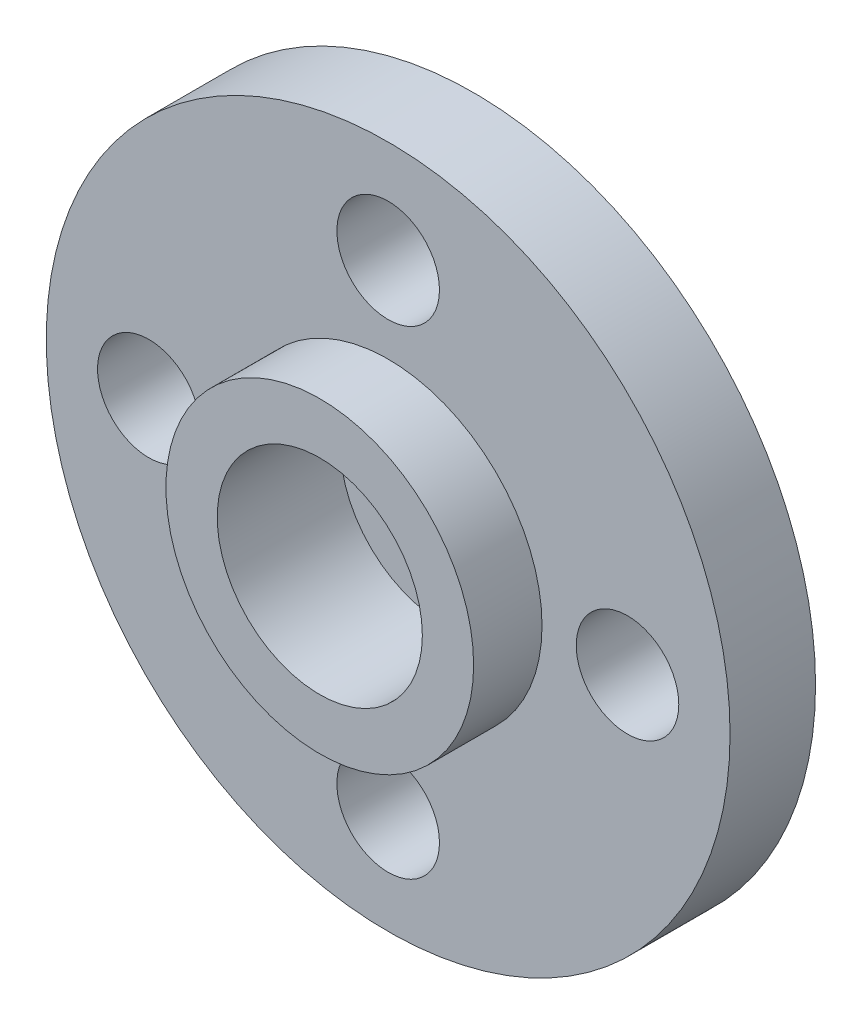
ISO-10303-21;
HEADER;
FILE_DESCRIPTION(('STEP AP214'),'2;1');
FILE_NAME('part.step','',(''),(''),'','','');
FILE_SCHEMA(('AUTOMOTIVE_DESIGN { 1 0 10303 214 1 1 1 1 }'));
ENDSEC;
DATA;
#1=APPLICATION_CONTEXT('core data for automotive mechanical design processes');
#2=APPLICATION_PROTOCOL_DEFINITION('international standard','automotive_design',2000,#1);
#3=PRODUCT_CONTEXT('',#1,'mechanical');
#4=PRODUCT('Part','Part','',(#3));
#5=PRODUCT_RELATED_PRODUCT_CATEGORY('part','',(#4));
#6=PRODUCT_DEFINITION_FORMATION('','',#4);
#7=PRODUCT_DEFINITION_CONTEXT('part definition',#1,'design');
#8=PRODUCT_DEFINITION('design','',#6,#7);
#9=PRODUCT_DEFINITION_SHAPE('','',#8);
#10=(LENGTH_UNIT() NAMED_UNIT(*) SI_UNIT(.MILLI.,.METRE.));
#11=(NAMED_UNIT(*) PLANE_ANGLE_UNIT() SI_UNIT($,.RADIAN.));
#12=(NAMED_UNIT(*) SI_UNIT($,.STERADIAN.) SOLID_ANGLE_UNIT());
#13=UNCERTAINTY_MEASURE_WITH_UNIT(LENGTH_MEASURE(1.E-05),#10,'distance_accuracy_value','');
#14=(GEOMETRIC_REPRESENTATION_CONTEXT(3) GLOBAL_UNCERTAINTY_ASSIGNED_CONTEXT((#13)) GLOBAL_UNIT_ASSIGNED_CONTEXT((#10,
#11,#12)) REPRESENTATION_CONTEXT('',''));
#15=CARTESIAN_POINT('',(0.,0.,0.));
#16=DIRECTION('',(0.,0.,1.));
#17=DIRECTION('',(1.,0.,0.));
#18=AXIS2_PLACEMENT_3D('',#15,#16,#17);
#19=CARTESIAN_POINT('',(0.,0.,2.5));
#20=DIRECTION('',(0.,0.,-1.));
#21=DIRECTION('',(-1.,0.,0.));
#22=AXIS2_PLACEMENT_3D('',#19,#20,#21);
#23=CYLINDRICAL_SURFACE('',#22,10.);
#24=CARTESIAN_POINT('',(0.,0.,2.5));
#25=DIRECTION('',(0.,0.,1.));
#26=DIRECTION('',(1.,0.,0.));
#27=AXIS2_PLACEMENT_3D('',#24,#25,#26);
#28=CIRCLE('',#27,10.);
#29=CARTESIAN_POINT('',(10.,0.,2.5));
#30=VERTEX_POINT('',#29);
#31=EDGE_CURVE('E47',#30,#30,#28,.T.);
#32=ORIENTED_EDGE('',*,*,#31,.F.);
#33=EDGE_LOOP('',(#32));
#34=FACE_BOUND('',#33,.T.);
#35=CARTESIAN_POINT('',(0.,0.,0.));
#36=DIRECTION('',(0.,0.,1.));
#37=DIRECTION('',(1.,0.,0.));
#38=AXIS2_PLACEMENT_3D('',#35,#36,#37);
#39=CIRCLE('',#38,10.);
#40=CARTESIAN_POINT('',(10.,0.,0.));
#41=VERTEX_POINT('',#40);
#42=EDGE_CURVE('E44',#41,#41,#39,.T.);
#43=ORIENTED_EDGE('',*,*,#42,.T.);
#44=EDGE_LOOP('',(#43));
#45=FACE_BOUND('',#44,.T.);
#46=ADVANCED_FACE('F45',(#34,#45),#23,.T.);
#47=CARTESIAN_POINT('',(0.,0.,2.5));
#48=DIRECTION('',(0.,0.,1.));
#49=DIRECTION('',(1.,0.,0.));
#50=AXIS2_PLACEMENT_3D('',#47,#48,#49);
#51=PLANE('',#50);
#52=CARTESIAN_POINT('',(0.,7.,2.5));
#53=DIRECTION('',(0.,0.,1.));
#54=DIRECTION('',(1.,0.,0.));
#55=AXIS2_PLACEMENT_3D('',#52,#53,#54);
#56=CIRCLE('',#55,1.5);
#57=CARTESIAN_POINT('',(1.5,7.,2.5));
#58=VERTEX_POINT('',#57);
#59=EDGE_CURVE('E87',#58,#58,#56,.T.);
#60=ORIENTED_EDGE('',*,*,#59,.F.);
#61=EDGE_LOOP('',(#60));
#62=FACE_BOUND('',#61,.T.);
#63=CARTESIAN_POINT('',(7.0000000000002,1.97666086873723E-13,2.5));
#64=DIRECTION('',(0.,0.,1.));
#65=DIRECTION('',(1.,0.,0.));
#66=AXIS2_PLACEMENT_3D('',#63,#64,#65);
#67=CIRCLE('',#66,1.50000000000015);
#68=CARTESIAN_POINT('',(8.50000000000035,1.97666086873723E-13,2.5));
#69=VERTEX_POINT('',#68);
#70=EDGE_CURVE('E82',#69,#69,#67,.T.);
#71=ORIENTED_EDGE('',*,*,#70,.F.);
#72=EDGE_LOOP('',(#71));
#73=FACE_BOUND('',#72,.T.);
#74=CARTESIAN_POINT('',(3.95332173747447E-13,-7.,2.5));
#75=DIRECTION('',(0.,0.,1.));
#76=DIRECTION('',(1.,0.,0.));
#77=AXIS2_PLACEMENT_3D('',#74,#75,#76);
#78=CIRCLE('',#77,1.50000000000042);
#79=CARTESIAN_POINT('',(1.50000000000082,-7.,2.5));
#80=VERTEX_POINT('',#79);
#81=EDGE_CURVE('E79',#80,#80,#78,.T.);
#82=ORIENTED_EDGE('',*,*,#81,.F.);
#83=EDGE_LOOP('',(#82));
#84=FACE_BOUND('',#83,.T.);
#85=CARTESIAN_POINT('',(-6.9999999999998,-1.98523339633126E-13,2.5));
#86=DIRECTION('',(0.,0.,1.));
#87=DIRECTION('',(1.,0.,0.));
#88=AXIS2_PLACEMENT_3D('',#85,#86,#87);
#89=CIRCLE('',#88,1.50000000000032);
#90=CARTESIAN_POINT('',(-5.49999999999949,-1.98523339633126E-13,2.5));
#91=VERTEX_POINT('',#90);
#92=EDGE_CURVE('E72',#91,#91,#89,.T.);
#93=ORIENTED_EDGE('',*,*,#92,.F.);
#94=EDGE_LOOP('',(#93));
#95=FACE_BOUND('',#94,.T.);
#96=CARTESIAN_POINT('',(0.,0.,2.5));
#97=DIRECTION('',(0.,0.,1.));
#98=DIRECTION('',(1.,0.,0.));
#99=AXIS2_PLACEMENT_3D('',#96,#97,#98);
#100=CIRCLE('',#99,4.5);
#101=CARTESIAN_POINT('',(4.5,0.,2.5));
#102=VERTEX_POINT('',#101);
#103=EDGE_CURVE('E10',#102,#102,#100,.T.);
#104=ORIENTED_EDGE('',*,*,#103,.F.);
#105=EDGE_LOOP('',(#104));
#106=FACE_BOUND('',#105,.T.);
#107=ORIENTED_EDGE('',*,*,#31,.T.);
#108=EDGE_LOOP('',(#107));
#109=FACE_BOUND('',#108,.T.);
#110=ADVANCED_FACE('F98',(#62,#73,#84,#95,#106,#109),#51,.T.);
#111=CARTESIAN_POINT('',(0.,0.,0.));
#112=DIRECTION('',(0.,0.,1.));
#113=DIRECTION('',(1.,0.,0.));
#114=AXIS2_PLACEMENT_3D('',#111,#112,#113);
#115=PLANE('',#114);
#116=CARTESIAN_POINT('',(0.,7.,0.));
#117=DIRECTION('',(0.,0.,1.));
#118=DIRECTION('',(1.,0.,0.));
#119=AXIS2_PLACEMENT_3D('',#116,#117,#118);
#120=CIRCLE('',#119,1.5);
#121=CARTESIAN_POINT('',(1.5,7.,0.));
#122=VERTEX_POINT('',#121);
#123=EDGE_CURVE('E68',#122,#122,#120,.F.);
#124=ORIENTED_EDGE('',*,*,#123,.F.);
#125=EDGE_LOOP('',(#124));
#126=FACE_BOUND('',#125,.T.);
#127=CARTESIAN_POINT('',(7.0000000000002,1.97666086873723E-13,0.));
#128=DIRECTION('',(0.,0.,1.));
#129=DIRECTION('',(1.,0.,0.));
#130=AXIS2_PLACEMENT_3D('',#127,#128,#129);
#131=CIRCLE('',#130,1.50000000000015);
#132=CARTESIAN_POINT('',(8.50000000000035,1.97666086873723E-13,0.));
#133=VERTEX_POINT('',#132);
#134=EDGE_CURVE('E81',#133,#133,#131,.F.);
#135=ORIENTED_EDGE('',*,*,#134,.F.);
#136=EDGE_LOOP('',(#135));
#137=FACE_BOUND('',#136,.T.);
#138=CARTESIAN_POINT('',(3.95332173747447E-13,-7.,0.));
#139=DIRECTION('',(0.,0.,1.));
#140=DIRECTION('',(1.,0.,0.));
#141=AXIS2_PLACEMENT_3D('',#138,#139,#140);
#142=CIRCLE('',#141,1.50000000000042);
#143=CARTESIAN_POINT('',(1.50000000000082,-7.,0.));
#144=VERTEX_POINT('',#143);
#145=EDGE_CURVE('E74',#144,#144,#142,.F.);
#146=ORIENTED_EDGE('',*,*,#145,.F.);
#147=EDGE_LOOP('',(#146));
#148=FACE_BOUND('',#147,.T.);
#149=CARTESIAN_POINT('',(-6.9999999999998,-1.98523339633126E-13,0.));
#150=DIRECTION('',(0.,0.,1.));
#151=DIRECTION('',(1.,0.,0.));
#152=AXIS2_PLACEMENT_3D('',#149,#150,#151);
#153=CIRCLE('',#152,1.50000000000032);
#154=CARTESIAN_POINT('',(-5.49999999999949,-1.98523339633126E-13,0.));
#155=VERTEX_POINT('',#154);
#156=EDGE_CURVE('E73',#155,#155,#153,.F.);
#157=ORIENTED_EDGE('',*,*,#156,.F.);
#158=EDGE_LOOP('',(#157));
#159=FACE_BOUND('',#158,.T.);
#160=CARTESIAN_POINT('',(0.,0.,0.));
#161=DIRECTION('',(0.,0.,1.));
#162=DIRECTION('',(1.,0.,0.));
#163=AXIS2_PLACEMENT_3D('',#160,#161,#162);
#164=CIRCLE('',#163,1.6);
#165=CARTESIAN_POINT('',(1.6,0.,0.));
#166=VERTEX_POINT('',#165);
#167=EDGE_CURVE('E62',#166,#166,#164,.F.);
#168=ORIENTED_EDGE('',*,*,#167,.F.);
#169=EDGE_LOOP('',(#168));
#170=FACE_BOUND('',#169,.T.);
#171=ORIENTED_EDGE('',*,*,#42,.F.);
#172=EDGE_LOOP('',(#171));
#173=FACE_BOUND('',#172,.T.);
#174=ADVANCED_FACE('F101',(#126,#137,#148,#159,#170,#173),#115,.F.);
#175=CARTESIAN_POINT('',(0.,0.,4.5));
#176=DIRECTION('',(0.,0.,-1.));
#177=DIRECTION('',(-1.,0.,0.));
#178=AXIS2_PLACEMENT_3D('',#175,#176,#177);
#179=CYLINDRICAL_SURFACE('',#178,4.5);
#180=CARTESIAN_POINT('',(0.,0.,4.5));
#181=DIRECTION('',(0.,0.,1.));
#182=DIRECTION('',(1.,0.,0.));
#183=AXIS2_PLACEMENT_3D('',#180,#181,#182);
#184=CIRCLE('',#183,4.5);
#185=CARTESIAN_POINT('',(4.5,0.,4.5));
#186=VERTEX_POINT('',#185);
#187=EDGE_CURVE('E54',#186,#186,#184,.T.);
#188=ORIENTED_EDGE('',*,*,#187,.F.);
#189=EDGE_LOOP('',(#188));
#190=FACE_BOUND('',#189,.T.);
#191=ORIENTED_EDGE('',*,*,#103,.T.);
#192=EDGE_LOOP('',(#191));
#193=FACE_BOUND('',#192,.T.);
#194=ADVANCED_FACE('F119',(#190,#193),#179,.T.);
#195=CARTESIAN_POINT('',(0.,0.,4.5));
#196=DIRECTION('',(0.,0.,1.));
#197=DIRECTION('',(1.,0.,0.));
#198=AXIS2_PLACEMENT_3D('',#195,#196,#197);
#199=PLANE('',#198);
#200=CARTESIAN_POINT('',(0.,0.,4.5));
#201=DIRECTION('',(0.,0.,1.));
#202=DIRECTION('',(1.,0.,0.));
#203=AXIS2_PLACEMENT_3D('',#200,#201,#202);
#204=CIRCLE('',#203,3.);
#205=CARTESIAN_POINT('',(3.,0.,4.5));
#206=VERTEX_POINT('',#205);
#207=EDGE_CURVE('E56',#206,#206,#204,.T.);
#208=ORIENTED_EDGE('',*,*,#207,.F.);
#209=EDGE_LOOP('',(#208));
#210=FACE_BOUND('',#209,.T.);
#211=ORIENTED_EDGE('',*,*,#187,.T.);
#212=EDGE_LOOP('',(#211));
#213=FACE_BOUND('',#212,.T.);
#214=ADVANCED_FACE('F121',(#210,#213),#199,.T.);
#215=CARTESIAN_POINT('',(0.,0.,0.900000000000001));
#216=DIRECTION('',(0.,0.,1.));
#217=DIRECTION('',(1.,0.,0.));
#218=AXIS2_PLACEMENT_3D('',#215,#216,#217);
#219=CYLINDRICAL_SURFACE('',#218,3.);
#220=CARTESIAN_POINT('',(0.,0.,0.900000000000001));
#221=DIRECTION('',(0.,0.,1.));
#222=DIRECTION('',(1.,0.,0.));
#223=AXIS2_PLACEMENT_3D('',#220,#221,#222);
#224=CIRCLE('',#223,3.);
#225=CARTESIAN_POINT('',(3.,0.,0.900000000000001));
#226=VERTEX_POINT('',#225);
#227=EDGE_CURVE('E59',#226,#226,#224,.T.);
#228=ORIENTED_EDGE('',*,*,#227,.F.);
#229=EDGE_LOOP('',(#228));
#230=FACE_BOUND('',#229,.T.);
#231=ORIENTED_EDGE('',*,*,#207,.T.);
#232=EDGE_LOOP('',(#231));
#233=FACE_BOUND('',#232,.T.);
#234=ADVANCED_FACE('F132',(#230,#233),#219,.F.);
#235=CARTESIAN_POINT('',(0.,0.,0.900000000000001));
#236=DIRECTION('',(0.,0.,1.));
#237=DIRECTION('',(1.,0.,0.));
#238=AXIS2_PLACEMENT_3D('',#235,#236,#237);
#239=PLANE('',#238);
#240=CARTESIAN_POINT('',(0.,0.,0.900000000000001));
#241=DIRECTION('',(0.,0.,1.));
#242=DIRECTION('',(1.,0.,0.));
#243=AXIS2_PLACEMENT_3D('',#240,#241,#242);
#244=CIRCLE('',#243,1.6);
#245=CARTESIAN_POINT('',(1.6,0.,0.900000000000001));
#246=VERTEX_POINT('',#245);
#247=EDGE_CURVE('E70',#246,#246,#244,.T.);
#248=ORIENTED_EDGE('',*,*,#247,.F.);
#249=EDGE_LOOP('',(#248));
#250=FACE_BOUND('',#249,.T.);
#251=ORIENTED_EDGE('',*,*,#227,.T.);
#252=EDGE_LOOP('',(#251));
#253=FACE_BOUND('',#252,.T.);
#254=ADVANCED_FACE('F136',(#250,#253),#239,.T.);
#255=CARTESIAN_POINT('',(0.,0.,-0.00100000000000002));
#256=DIRECTION('',(0.,0.,1.));
#257=DIRECTION('',(1.,0.,0.));
#258=AXIS2_PLACEMENT_3D('',#255,#256,#257);
#259=CYLINDRICAL_SURFACE('',#258,1.6);
#260=CARTESIAN_POINT('',(1.6,0.,0.900000000000001));
#261=CARTESIAN_POINT('',(1.6,0.,0.890625000000001));
#262=CARTESIAN_POINT('',(1.6,0.,0.881250000000001));
#263=CARTESIAN_POINT('',(1.6,0.,0.8625));
#264=CARTESIAN_POINT('',(1.6,0.,0.853125000000001));
#265=CARTESIAN_POINT('',(1.6,0.,0.834375000000001));
#266=CARTESIAN_POINT('',(1.6,0.,0.825000000000001));
#267=CARTESIAN_POINT('',(1.6,0.,0.806250000000001));
#268=CARTESIAN_POINT('',(1.6,0.,0.796875000000001));
#269=CARTESIAN_POINT('',(1.6,0.,0.778125000000001));
#270=CARTESIAN_POINT('',(1.6,0.,0.768750000000001));
#271=CARTESIAN_POINT('',(1.6,0.,0.75));
#272=CARTESIAN_POINT('',(1.6,0.,0.740625000000001));
#273=CARTESIAN_POINT('',(1.6,0.,0.721875));
#274=CARTESIAN_POINT('',(1.6,0.,0.7125));
#275=CARTESIAN_POINT('',(1.6,0.,0.69375));
#276=CARTESIAN_POINT('',(1.6,0.,0.684375));
#277=CARTESIAN_POINT('',(1.6,0.,0.665625));
#278=CARTESIAN_POINT('',(1.6,0.,0.65625));
#279=CARTESIAN_POINT('',(1.6,0.,0.6375));
#280=CARTESIAN_POINT('',(1.6,0.,0.628125));
#281=CARTESIAN_POINT('',(1.6,0.,0.609375));
#282=CARTESIAN_POINT('',(1.6,0.,0.6));
#283=CARTESIAN_POINT('',(1.6,0.,0.58125));
#284=CARTESIAN_POINT('',(1.6,0.,0.571875));
#285=CARTESIAN_POINT('',(1.6,0.,0.553125));
#286=CARTESIAN_POINT('',(1.6,0.,0.54375));
#287=CARTESIAN_POINT('',(1.6,0.,0.525));
#288=CARTESIAN_POINT('',(1.6,0.,0.515625));
#289=CARTESIAN_POINT('',(1.6,0.,0.496875));
#290=CARTESIAN_POINT('',(1.6,0.,0.4875));
#291=CARTESIAN_POINT('',(1.6,0.,0.46875));
#292=CARTESIAN_POINT('',(1.6,0.,0.459375));
#293=CARTESIAN_POINT('',(1.6,0.,0.440625));
#294=CARTESIAN_POINT('',(1.6,0.,0.43125));
#295=CARTESIAN_POINT('',(1.6,0.,0.4125));
#296=CARTESIAN_POINT('',(1.6,0.,0.403125));
#297=CARTESIAN_POINT('',(1.6,0.,0.384375));
#298=CARTESIAN_POINT('',(1.6,0.,0.375));
#299=CARTESIAN_POINT('',(1.6,0.,0.35625));
#300=CARTESIAN_POINT('',(1.6,0.,0.346875));
#301=CARTESIAN_POINT('',(1.6,0.,0.328125));
#302=CARTESIAN_POINT('',(1.6,0.,0.31875));
#303=CARTESIAN_POINT('',(1.6,0.,0.3));
#304=CARTESIAN_POINT('',(1.6,0.,0.290625));
#305=CARTESIAN_POINT('',(1.6,0.,0.271875));
#306=CARTESIAN_POINT('',(1.6,0.,0.2625));
#307=CARTESIAN_POINT('',(1.6,0.,0.24375));
#308=CARTESIAN_POINT('',(1.6,0.,0.234375));
#309=CARTESIAN_POINT('',(1.6,0.,0.215625));
#310=CARTESIAN_POINT('',(1.6,0.,0.20625));
#311=CARTESIAN_POINT('',(1.6,0.,0.1875));
#312=CARTESIAN_POINT('',(1.6,0.,0.178125));
#313=CARTESIAN_POINT('',(1.6,0.,0.159375));
#314=CARTESIAN_POINT('',(1.6,0.,0.15));
#315=CARTESIAN_POINT('',(1.6,0.,0.13125));
#316=CARTESIAN_POINT('',(1.6,0.,0.121875));
#317=CARTESIAN_POINT('',(1.6,0.,0.103125));
#318=CARTESIAN_POINT('',(1.6,0.,0.09375));
#319=CARTESIAN_POINT('',(1.6,0.,0.075));
#320=CARTESIAN_POINT('',(1.6,0.,0.0656250000000001));
#321=CARTESIAN_POINT('',(1.6,0.,0.0468750000000001));
#322=CARTESIAN_POINT('',(1.6,0.,0.0375000000000001));
#323=CARTESIAN_POINT('',(1.6,0.,0.01875));
#324=CARTESIAN_POINT('',(1.6,0.,0.00937500000000001));
#325=CARTESIAN_POINT('',(1.6,0.,0.));
#326=B_SPLINE_CURVE_WITH_KNOTS('',3,(#260,#261,#262,#263,#264,#265,#266,#267,#268,#269,#270,
#271,#272,#273,#274,#275,#276,#277,#278,#279,#280,#281,#282,#283,#284,#285,#286,#287,#288,#289,
#290,#291,#292,#293,#294,#295,#296,#297,#298,#299,#300,#301,#302,#303,#304,#305,#306,#307,#308,
#309,#310,#311,#312,#313,#314,#315,#316,#317,#318,#319,#320,#321,#322,#323,#324,#325),
.UNSPECIFIED.,.F.,.F.,(4,2,2,2,2,2,2,2,2,2,2,2,2,2,2,2,2,2,2,2,2,2,2,2,2,2,2,2,2,2,2,2,4),(0.,
0.028125,0.0562500000000001,0.084375,0.1125,0.140625,0.16875,0.196875,0.225,0.253125,0.28125,
0.309375,0.3375,0.365625,0.39375,0.421875,0.45,0.478125,0.50625,0.534375,0.5625,0.590625,
0.61875,0.646875000000001,0.675000000000001,0.703125000000001,0.731250000000001,
0.759375000000001,0.787500000000001,0.815625000000001,0.843750000000001,0.871875000000001,
0.900000000000001),.UNSPECIFIED.);
#327=EDGE_CURVE('BSEAM139',#246,#166,#326,.T.);
#328=ORIENTED_EDGE('',*,*,#247,.T.);
#329=ORIENTED_EDGE('',*,*,#167,.T.);
#330=ORIENTED_EDGE('',*,*,#327,.T.);
#331=ORIENTED_EDGE('',*,*,#327,.F.);
#332=EDGE_LOOP('',(#328,#330,#329,#331));
#333=FACE_BOUND('',#332,.T.);
#334=ADVANCED_FACE('F139',(#333),#259,.F.);
#335=CARTESIAN_POINT('',(-6.9999999999998,-1.98523339633126E-13,-0.00100000000000013));
#336=DIRECTION('',(0.,0.,1.));
#337=DIRECTION('',(1.,0.,0.));
#338=AXIS2_PLACEMENT_3D('',#335,#336,#337);
#339=CYLINDRICAL_SURFACE('',#338,1.50000000000032);
#340=ORIENTED_EDGE('',*,*,#92,.T.);
#341=EDGE_LOOP('',(#340));
#342=FACE_BOUND('',#341,.T.);
#343=ORIENTED_EDGE('',*,*,#156,.T.);
#344=EDGE_LOOP('',(#343));
#345=FACE_BOUND('',#344,.T.);
#346=ADVANCED_FACE('F145',(#342,#345),#339,.F.);
#347=CARTESIAN_POINT('',(3.95332173747447E-13,-7.,-0.00100000000000013));
#348=DIRECTION('',(0.,0.,1.));
#349=DIRECTION('',(1.,0.,0.));
#350=AXIS2_PLACEMENT_3D('',#347,#348,#349);
#351=CYLINDRICAL_SURFACE('',#350,1.50000000000042);
#352=ORIENTED_EDGE('',*,*,#81,.T.);
#353=EDGE_LOOP('',(#352));
#354=FACE_BOUND('',#353,.T.);
#355=ORIENTED_EDGE('',*,*,#145,.T.);
#356=EDGE_LOOP('',(#355));
#357=FACE_BOUND('',#356,.T.);
#358=ADVANCED_FACE('F150',(#354,#357),#351,.F.);
#359=CARTESIAN_POINT('',(7.0000000000002,1.97666086873723E-13,-0.00100000000000013));
#360=DIRECTION('',(0.,0.,1.));
#361=DIRECTION('',(1.,0.,0.));
#362=AXIS2_PLACEMENT_3D('',#359,#360,#361);
#363=CYLINDRICAL_SURFACE('',#362,1.50000000000015);
#364=ORIENTED_EDGE('',*,*,#70,.T.);
#365=EDGE_LOOP('',(#364));
#366=FACE_BOUND('',#365,.T.);
#367=ORIENTED_EDGE('',*,*,#134,.T.);
#368=EDGE_LOOP('',(#367));
#369=FACE_BOUND('',#368,.T.);
#370=ADVANCED_FACE('F151',(#366,#369),#363,.F.);
#371=CARTESIAN_POINT('',(0.,7.,-0.00100000000000013));
#372=DIRECTION('',(0.,0.,1.));
#373=DIRECTION('',(1.,0.,0.));
#374=AXIS2_PLACEMENT_3D('',#371,#372,#373);
#375=CYLINDRICAL_SURFACE('',#374,1.5);
#376=ORIENTED_EDGE('',*,*,#59,.T.);
#377=EDGE_LOOP('',(#376));
#378=FACE_BOUND('',#377,.T.);
#379=ORIENTED_EDGE('',*,*,#123,.T.);
#380=EDGE_LOOP('',(#379));
#381=FACE_BOUND('',#380,.T.);
#382=ADVANCED_FACE('F92',(#378,#381),#375,.F.);
#383=CLOSED_SHELL('',(#46,#110,#174,#194,#214,#234,#254,#334,#346,#358,#370,#382));
#384=MANIFOLD_SOLID_BREP('B2',#383);
#385=ADVANCED_BREP_SHAPE_REPRESENTATION('',(#18,#384),#14);
#386=SHAPE_DEFINITION_REPRESENTATION(#9,#385);
ENDSEC;
END-ISO-10303-21;
